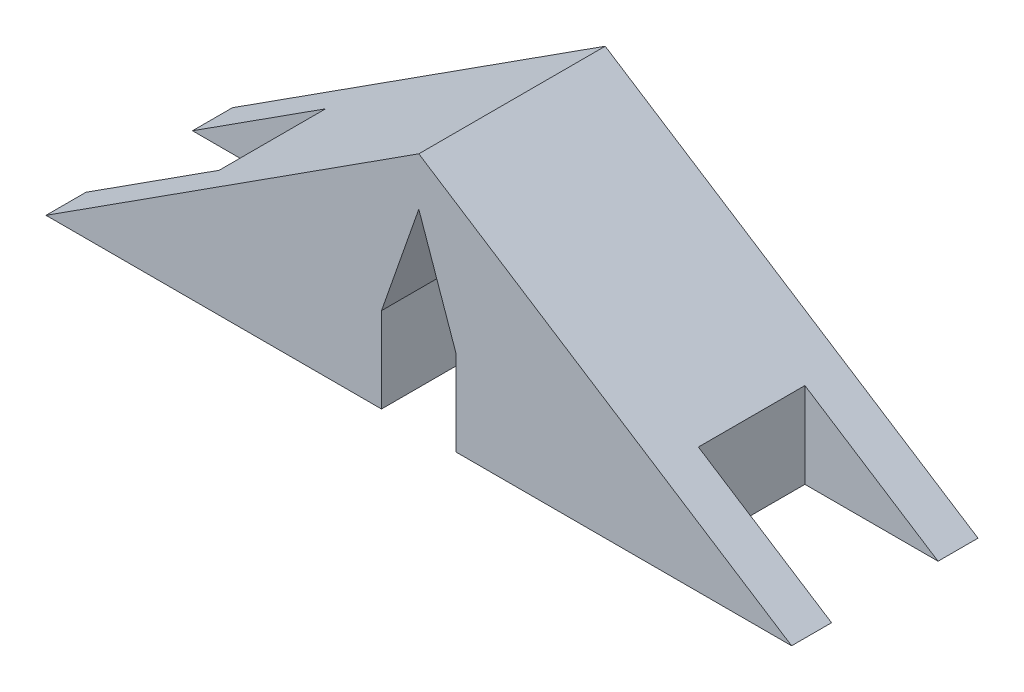
ISO-10303-21;
HEADER;
FILE_DESCRIPTION(('STEP AP214'),'2;1');
FILE_NAME('part.step','',(''),(''),'','','');
FILE_SCHEMA(('AUTOMOTIVE_DESIGN { 1 0 10303 214 1 1 1 1 }'));
ENDSEC;
DATA;
#1=APPLICATION_CONTEXT('core data for automotive mechanical design processes');
#2=APPLICATION_PROTOCOL_DEFINITION('international standard','automotive_design',2000,#1);
#3=PRODUCT_CONTEXT('',#1,'mechanical');
#4=PRODUCT('Part','Part','',(#3));
#5=PRODUCT_RELATED_PRODUCT_CATEGORY('part','',(#4));
#6=PRODUCT_DEFINITION_FORMATION('','',#4);
#7=PRODUCT_DEFINITION_CONTEXT('part definition',#1,'design');
#8=PRODUCT_DEFINITION('design','',#6,#7);
#9=PRODUCT_DEFINITION_SHAPE('','',#8);
#10=(LENGTH_UNIT() NAMED_UNIT(*) SI_UNIT(.MILLI.,.METRE.));
#11=(NAMED_UNIT(*) PLANE_ANGLE_UNIT() SI_UNIT($,.RADIAN.));
#12=(NAMED_UNIT(*) SI_UNIT($,.STERADIAN.) SOLID_ANGLE_UNIT());
#13=UNCERTAINTY_MEASURE_WITH_UNIT(LENGTH_MEASURE(1.E-05),#10,'distance_accuracy_value','');
#14=(GEOMETRIC_REPRESENTATION_CONTEXT(3) GLOBAL_UNCERTAINTY_ASSIGNED_CONTEXT((#13)) GLOBAL_UNIT_ASSIGNED_CONTEXT((#10,
#11,#12)) REPRESENTATION_CONTEXT('',''));
#15=CARTESIAN_POINT('',(0.,0.,0.));
#16=DIRECTION('',(0.,0.,1.));
#17=DIRECTION('',(1.,0.,0.));
#18=AXIS2_PLACEMENT_3D('',#15,#16,#17);
#19=CARTESIAN_POINT('',(70.,-22.5,35.));
#20=DIRECTION('',(0.,-1.,0.));
#21=DIRECTION('',(0.,0.,-1.));
#22=AXIS2_PLACEMENT_3D('',#19,#20,#21);
#23=PLANE('',#22);
#24=DIRECTION('',(0.,0.,-1.));
#25=VECTOR('',#24,1.);
#26=CARTESIAN_POINT('',(105.,-22.5,35.));
#27=LINE('',#26,#25);
#28=CARTESIAN_POINT('',(105.,-22.5,7.50000000000001));
#29=VERTEX_POINT('',#28);
#30=CARTESIAN_POINT('',(105.,-22.5,0.));
#31=VERTEX_POINT('',#30);
#32=EDGE_CURVE('E162',#29,#31,#27,.T.);
#33=ORIENTED_EDGE('',*,*,#32,.F.);
#34=DIRECTION('',(-1.,0.,0.));
#35=VECTOR('',#34,1.);
#36=CARTESIAN_POINT('',(80.,-22.5,7.50000000000001));
#37=LINE('',#36,#35);
#38=CARTESIAN_POINT('',(80.,-22.5,7.50000000000001));
#39=VERTEX_POINT('',#38);
#40=EDGE_CURVE('E225',#29,#39,#37,.T.);
#41=ORIENTED_EDGE('',*,*,#40,.T.);
#42=DIRECTION('',(0.,0.,1.));
#43=VECTOR('',#42,1.);
#44=CARTESIAN_POINT('',(80.,-22.5,7.50000000000001));
#45=LINE('',#44,#43);
#46=CARTESIAN_POINT('',(80.,-22.5,27.5));
#47=VERTEX_POINT('',#46);
#48=EDGE_CURVE('E153',#39,#47,#45,.T.);
#49=ORIENTED_EDGE('',*,*,#48,.T.);
#50=DIRECTION('',(1.,0.,0.));
#51=VECTOR('',#50,1.);
#52=CARTESIAN_POINT('',(80.,-22.5,27.5));
#53=LINE('',#52,#51);
#54=CARTESIAN_POINT('',(105.,-22.5,27.5));
#55=VERTEX_POINT('',#54);
#56=EDGE_CURVE('E139',#47,#55,#53,.T.);
#57=ORIENTED_EDGE('',*,*,#56,.T.);
#58=CARTESIAN_POINT('',(105.,-22.5,35.));
#59=VERTEX_POINT('',#58);
#60=EDGE_CURVE('E149',#59,#55,#27,.T.);
#61=ORIENTED_EDGE('',*,*,#60,.F.);
#62=DIRECTION('',(-1.,0.,0.));
#63=VECTOR('',#62,1.);
#64=CARTESIAN_POINT('',(70.,-22.5,35.));
#65=LINE('',#64,#63);
#66=CARTESIAN_POINT('',(42.,-22.5,35.));
#67=VERTEX_POINT('',#66);
#68=EDGE_CURVE('E242',#59,#67,#65,.T.);
#69=ORIENTED_EDGE('',*,*,#68,.T.);
#70=DIRECTION('',(0.,0.,-1.));
#71=VECTOR('',#70,1.);
#72=CARTESIAN_POINT('',(42.,-22.5,35.));
#73=LINE('',#72,#71);
#74=CARTESIAN_POINT('',(42.,-22.5,0.));
#75=VERTEX_POINT('',#74);
#76=EDGE_CURVE('E161',#67,#75,#73,.T.);
#77=ORIENTED_EDGE('',*,*,#76,.T.);
#78=DIRECTION('',(-1.,0.,0.));
#79=VECTOR('',#78,1.);
#80=CARTESIAN_POINT('',(70.,-22.5,0.));
#81=LINE('',#80,#79);
#82=EDGE_CURVE('E227',#31,#75,#81,.T.);
#83=ORIENTED_EDGE('',*,*,#82,.F.);
#84=EDGE_LOOP('',(#33,#41,#49,#57,#61,#69,#77,#83));
#85=FACE_BOUND('',#84,.T.);
#86=ADVANCED_FACE('F36',(#85),#23,.T.);
#87=CARTESIAN_POINT('',(70.,0.,35.));
#88=DIRECTION('',(-0.540757591313499,-0.841178475376554,0.));
#89=DIRECTION('',(0.841178475376554,-0.540757591313499,0.));
#90=AXIS2_PLACEMENT_3D('',#87,#88,#89);
#91=PLANE('',#90);
#92=DIRECTION('',(-0.841178475376554,0.540757591313499,0.));
#93=VECTOR('',#92,1.);
#94=CARTESIAN_POINT('',(70.,0.,7.50000000000001));
#95=LINE('',#94,#93);
#96=CARTESIAN_POINT('',(80.,-6.42857142857142,7.50000000000001));
#97=VERTEX_POINT('',#96);
#98=EDGE_CURVE('E11',#29,#97,#95,.T.);
#99=ORIENTED_EDGE('',*,*,#98,.F.);
#100=ORIENTED_EDGE('',*,*,#32,.T.);
#101=DIRECTION('',(-0.841178475376554,0.540757591313499,0.));
#102=VECTOR('',#101,1.);
#103=CARTESIAN_POINT('',(70.,0.,0.));
#104=LINE('',#103,#102);
#105=CARTESIAN_POINT('',(35.,22.5,0.));
#106=VERTEX_POINT('',#105);
#107=EDGE_CURVE('E231',#31,#106,#104,.T.);
#108=ORIENTED_EDGE('',*,*,#107,.T.);
#109=DIRECTION('',(0.,0.,-1.));
#110=VECTOR('',#109,1.);
#111=CARTESIAN_POINT('',(35.,22.5,35.));
#112=LINE('',#111,#110);
#113=CARTESIAN_POINT('',(35.,22.5,35.));
#114=VERTEX_POINT('',#113);
#115=EDGE_CURVE('E211',#114,#106,#112,.T.);
#116=ORIENTED_EDGE('',*,*,#115,.F.);
#117=DIRECTION('',(-0.841178475376554,0.540757591313499,0.));
#118=VECTOR('',#117,1.);
#119=CARTESIAN_POINT('',(70.,0.,35.));
#120=LINE('',#119,#118);
#121=EDGE_CURVE('E159',#59,#114,#120,.T.);
#122=ORIENTED_EDGE('',*,*,#121,.F.);
#123=ORIENTED_EDGE('',*,*,#60,.T.);
#124=DIRECTION('',(0.841178475376554,-0.540757591313499,0.));
#125=VECTOR('',#124,1.);
#126=CARTESIAN_POINT('',(70.,0.,27.5));
#127=LINE('',#126,#125);
#128=CARTESIAN_POINT('',(80.,-6.42857142857143,27.5));
#129=VERTEX_POINT('',#128);
#130=EDGE_CURVE('E136',#129,#55,#127,.T.);
#131=ORIENTED_EDGE('',*,*,#130,.F.);
#132=DIRECTION('',(0.,0.,1.));
#133=VECTOR('',#132,1.);
#134=CARTESIAN_POINT('',(80.,-6.42857142857143,35.));
#135=LINE('',#134,#133);
#136=EDGE_CURVE('E44',#97,#129,#135,.T.);
#137=ORIENTED_EDGE('',*,*,#136,.F.);
#138=EDGE_LOOP('',(#99,#100,#108,#116,#122,#123,#131,#137));
#139=FACE_BOUND('',#138,.T.);
#140=ADVANCED_FACE('F156',(#139),#91,.F.);
#141=CARTESIAN_POINT('',(28.,0.,35.));
#142=DIRECTION('',(-1.,0.,0.));
#143=DIRECTION('',(0.,-1.,0.));
#144=AXIS2_PLACEMENT_3D('',#141,#142,#143);
#145=PLANE('',#144);
#146=DIRECTION('',(0.,1.,0.));
#147=VECTOR('',#146,1.);
#148=CARTESIAN_POINT('',(28.,0.,0.));
#149=LINE('',#148,#147);
#150=CARTESIAN_POINT('',(28.,-22.5,0.));
#151=VERTEX_POINT('',#150);
#152=CARTESIAN_POINT('',(28.,-6.5,0.));
#153=VERTEX_POINT('',#152);
#154=EDGE_CURVE('E185',#151,#153,#149,.T.);
#155=ORIENTED_EDGE('',*,*,#154,.T.);
#156=DIRECTION('',(0.,0.,-1.));
#157=VECTOR('',#156,1.);
#158=CARTESIAN_POINT('',(28.,-6.5,35.));
#159=LINE('',#158,#157);
#160=CARTESIAN_POINT('',(28.,-6.5,35.));
#161=VERTEX_POINT('',#160);
#162=EDGE_CURVE('E144',#161,#153,#159,.T.);
#163=ORIENTED_EDGE('',*,*,#162,.F.);
#164=DIRECTION('',(0.,1.,0.));
#165=VECTOR('',#164,1.);
#166=CARTESIAN_POINT('',(28.,0.,35.));
#167=LINE('',#166,#165);
#168=CARTESIAN_POINT('',(28.,-22.5,35.));
#169=VERTEX_POINT('',#168);
#170=EDGE_CURVE('E186',#169,#161,#167,.T.);
#171=ORIENTED_EDGE('',*,*,#170,.F.);
#172=DIRECTION('',(0.,0.,-1.));
#173=VECTOR('',#172,1.);
#174=CARTESIAN_POINT('',(28.,-22.5,35.));
#175=LINE('',#174,#173);
#176=EDGE_CURVE('E196',#169,#151,#175,.T.);
#177=ORIENTED_EDGE('',*,*,#176,.T.);
#178=EDGE_LOOP('',(#155,#163,#171,#177));
#179=FACE_BOUND('',#178,.T.);
#180=ADVANCED_FACE('F38',(#179),#145,.F.);
#181=CARTESIAN_POINT('',(26.9710467706013,-9.43986636971046,35.));
#182=DIRECTION('',(-0.943858356366018,0.330350424728106,0.));
#183=DIRECTION('',(-0.330350424728106,-0.943858356366018,0.));
#184=AXIS2_PLACEMENT_3D('',#181,#182,#183);
#185=PLANE('',#184);
#186=DIRECTION('',(0.330350424728106,0.943858356366018,0.));
#187=VECTOR('',#186,1.);
#188=CARTESIAN_POINT('',(26.9710467706013,-9.43986636971046,0.));
#189=LINE('',#188,#187);
#190=CARTESIAN_POINT('',(35.,13.5,0.));
#191=VERTEX_POINT('',#190);
#192=EDGE_CURVE('E199',#153,#191,#189,.T.);
#193=ORIENTED_EDGE('',*,*,#192,.T.);
#194=DIRECTION('',(0.,0.,-1.));
#195=VECTOR('',#194,1.);
#196=CARTESIAN_POINT('',(35.,13.5,35.));
#197=LINE('',#196,#195);
#198=CARTESIAN_POINT('',(35.,13.5,35.));
#199=VERTEX_POINT('',#198);
#200=EDGE_CURVE('E213',#199,#191,#197,.T.);
#201=ORIENTED_EDGE('',*,*,#200,.F.);
#202=DIRECTION('',(0.330350424728106,0.943858356366018,0.));
#203=VECTOR('',#202,1.);
#204=CARTESIAN_POINT('',(26.9710467706013,-9.43986636971046,35.));
#205=LINE('',#204,#203);
#206=EDGE_CURVE('E189',#161,#199,#205,.T.);
#207=ORIENTED_EDGE('',*,*,#206,.F.);
#208=ORIENTED_EDGE('',*,*,#162,.T.);
#209=EDGE_LOOP('',(#193,#201,#207,#208));
#210=FACE_BOUND('',#209,.T.);
#211=ADVANCED_FACE('F260',(#210),#185,.F.);
#212=CARTESIAN_POINT('',(0.,0.,35.));
#213=DIRECTION('',(-0.540757591313499,0.841178475376554,0.));
#214=DIRECTION('',(-0.841178475376554,-0.540757591313499,0.));
#215=AXIS2_PLACEMENT_3D('',#212,#213,#214);
#216=PLANE('',#215);
#217=DIRECTION('',(0.841178475376554,0.540757591313499,0.));
#218=VECTOR('',#217,1.);
#219=CARTESIAN_POINT('',(0.,0.,27.5));
#220=LINE('',#219,#218);
#221=CARTESIAN_POINT('',(-35.,-22.5,27.5));
#222=VERTEX_POINT('',#221);
#223=CARTESIAN_POINT('',(-10.,-6.42857142857142,27.5));
#224=VERTEX_POINT('',#223);
#225=EDGE_CURVE('E183',#222,#224,#220,.T.);
#226=ORIENTED_EDGE('',*,*,#225,.F.);
#227=DIRECTION('',(0.,0.,-1.));
#228=VECTOR('',#227,1.);
#229=CARTESIAN_POINT('',(-35.,-22.5,35.));
#230=LINE('',#229,#228);
#231=CARTESIAN_POINT('',(-35.,-22.5,35.));
#232=VERTEX_POINT('',#231);
#233=EDGE_CURVE('E208',#232,#222,#230,.T.);
#234=ORIENTED_EDGE('',*,*,#233,.F.);
#235=DIRECTION('',(0.841178475376554,0.540757591313499,0.));
#236=VECTOR('',#235,1.);
#237=CARTESIAN_POINT('',(0.,0.,35.));
#238=LINE('',#237,#236);
#239=EDGE_CURVE('E192',#232,#114,#238,.T.);
#240=ORIENTED_EDGE('',*,*,#239,.T.);
#241=ORIENTED_EDGE('',*,*,#115,.T.);
#242=DIRECTION('',(0.841178475376554,0.540757591313499,0.));
#243=VECTOR('',#242,1.);
#244=CARTESIAN_POINT('',(0.,0.,0.));
#245=LINE('',#244,#243);
#246=CARTESIAN_POINT('',(-35.,-22.5,0.));
#247=VERTEX_POINT('',#246);
#248=EDGE_CURVE('E201',#247,#106,#245,.T.);
#249=ORIENTED_EDGE('',*,*,#248,.F.);
#250=CARTESIAN_POINT('',(-35.,-22.5,7.50000000000001));
#251=VERTEX_POINT('',#250);
#252=EDGE_CURVE('E207',#251,#247,#230,.T.);
#253=ORIENTED_EDGE('',*,*,#252,.F.);
#254=DIRECTION('',(-0.841178475376554,-0.540757591313499,0.));
#255=VECTOR('',#254,1.);
#256=CARTESIAN_POINT('',(0.,0.,7.50000000000001));
#257=LINE('',#256,#255);
#258=CARTESIAN_POINT('',(-10.,-6.42857142857142,7.50000000000001));
#259=VERTEX_POINT('',#258);
#260=EDGE_CURVE('E59',#259,#251,#257,.T.);
#261=ORIENTED_EDGE('',*,*,#260,.F.);
#262=DIRECTION('',(0.,0.,-1.));
#263=VECTOR('',#262,1.);
#264=CARTESIAN_POINT('',(-10.,-6.42857142857143,35.));
#265=LINE('',#264,#263);
#266=EDGE_CURVE('E181',#224,#259,#265,.T.);
#267=ORIENTED_EDGE('',*,*,#266,.F.);
#268=EDGE_LOOP('',(#226,#234,#240,#241,#249,#253,#261,#267));
#269=FACE_BOUND('',#268,.T.);
#270=ADVANCED_FACE('F275',(#269),#216,.T.);
#271=CARTESIAN_POINT('',(0.,-22.5,35.));
#272=DIRECTION('',(0.,1.,0.));
#273=DIRECTION('',(0.,0.,1.));
#274=AXIS2_PLACEMENT_3D('',#271,#272,#273);
#275=PLANE('',#274);
#276=ORIENTED_EDGE('',*,*,#233,.T.);
#277=DIRECTION('',(-1.,0.,0.));
#278=VECTOR('',#277,1.);
#279=CARTESIAN_POINT('',(-10.,-22.5,27.5));
#280=LINE('',#279,#278);
#281=CARTESIAN_POINT('',(-10.,-22.5,27.5));
#282=VERTEX_POINT('',#281);
#283=EDGE_CURVE('E174',#282,#222,#280,.T.);
#284=ORIENTED_EDGE('',*,*,#283,.F.);
#285=DIRECTION('',(0.,0.,1.));
#286=VECTOR('',#285,1.);
#287=CARTESIAN_POINT('',(-10.,-22.5,7.50000000000001));
#288=LINE('',#287,#286);
#289=CARTESIAN_POINT('',(-10.,-22.5,7.50000000000001));
#290=VERTEX_POINT('',#289);
#291=EDGE_CURVE('E171',#290,#282,#288,.T.);
#292=ORIENTED_EDGE('',*,*,#291,.F.);
#293=DIRECTION('',(1.,0.,0.));
#294=VECTOR('',#293,1.);
#295=CARTESIAN_POINT('',(-10.,-22.5,7.50000000000001));
#296=LINE('',#295,#294);
#297=EDGE_CURVE('E164',#251,#290,#296,.T.);
#298=ORIENTED_EDGE('',*,*,#297,.F.);
#299=ORIENTED_EDGE('',*,*,#252,.T.);
#300=DIRECTION('',(1.,0.,0.));
#301=VECTOR('',#300,1.);
#302=CARTESIAN_POINT('',(0.,-22.5,0.));
#303=LINE('',#302,#301);
#304=EDGE_CURVE('E190',#247,#151,#303,.T.);
#305=ORIENTED_EDGE('',*,*,#304,.T.);
#306=ORIENTED_EDGE('',*,*,#176,.F.);
#307=DIRECTION('',(1.,0.,0.));
#308=VECTOR('',#307,1.);
#309=CARTESIAN_POINT('',(0.,-22.5,35.));
#310=LINE('',#309,#308);
#311=EDGE_CURVE('E194',#232,#169,#310,.T.);
#312=ORIENTED_EDGE('',*,*,#311,.F.);
#313=EDGE_LOOP('',(#276,#284,#292,#298,#299,#305,#306,#312));
#314=FACE_BOUND('',#313,.T.);
#315=ADVANCED_FACE('F269',(#314),#275,.F.);
#316=CARTESIAN_POINT('',(0.,0.,35.));
#317=DIRECTION('',(0.,0.,1.));
#318=DIRECTION('',(1.,0.,0.));
#319=AXIS2_PLACEMENT_3D('',#316,#317,#318);
#320=PLANE('',#319);
#321=ORIENTED_EDGE('',*,*,#170,.T.);
#322=ORIENTED_EDGE('',*,*,#206,.T.);
#323=DIRECTION('',(-0.330350424728106,0.943858356366018,0.));
#324=VECTOR('',#323,1.);
#325=CARTESIAN_POINT('',(43.0289532293987,-9.43986636971046,35.));
#326=LINE('',#325,#324);
#327=CARTESIAN_POINT('',(42.,-6.5,35.));
#328=VERTEX_POINT('',#327);
#329=EDGE_CURVE('E251',#328,#199,#326,.T.);
#330=ORIENTED_EDGE('',*,*,#329,.F.);
#331=DIRECTION('',(0.,1.,0.));
#332=VECTOR('',#331,1.);
#333=CARTESIAN_POINT('',(42.,0.,35.));
#334=LINE('',#333,#332);
#335=EDGE_CURVE('E239',#67,#328,#334,.T.);
#336=ORIENTED_EDGE('',*,*,#335,.F.);
#337=ORIENTED_EDGE('',*,*,#68,.F.);
#338=ORIENTED_EDGE('',*,*,#121,.T.);
#339=ORIENTED_EDGE('',*,*,#239,.F.);
#340=ORIENTED_EDGE('',*,*,#311,.T.);
#341=EDGE_LOOP('',(#321,#322,#330,#336,#337,#338,#339,#340));
#342=FACE_BOUND('',#341,.T.);
#343=ADVANCED_FACE('F278',(#342),#320,.T.);
#344=CARTESIAN_POINT('',(0.,0.,0.));
#345=DIRECTION('',(0.,0.,1.));
#346=DIRECTION('',(1.,0.,0.));
#347=AXIS2_PLACEMENT_3D('',#344,#345,#346);
#348=PLANE('',#347);
#349=ORIENTED_EDGE('',*,*,#154,.F.);
#350=ORIENTED_EDGE('',*,*,#304,.F.);
#351=ORIENTED_EDGE('',*,*,#248,.T.);
#352=ORIENTED_EDGE('',*,*,#107,.F.);
#353=ORIENTED_EDGE('',*,*,#82,.T.);
#354=DIRECTION('',(0.,1.,0.));
#355=VECTOR('',#354,1.);
#356=CARTESIAN_POINT('',(42.,0.,0.));
#357=LINE('',#356,#355);
#358=CARTESIAN_POINT('',(42.,-6.5,0.));
#359=VERTEX_POINT('',#358);
#360=EDGE_CURVE('E232',#75,#359,#357,.T.);
#361=ORIENTED_EDGE('',*,*,#360,.T.);
#362=DIRECTION('',(-0.330350424728106,0.943858356366018,0.));
#363=VECTOR('',#362,1.);
#364=CARTESIAN_POINT('',(43.0289532293987,-9.43986636971046,0.));
#365=LINE('',#364,#363);
#366=EDGE_CURVE('E234',#359,#191,#365,.T.);
#367=ORIENTED_EDGE('',*,*,#366,.T.);
#368=ORIENTED_EDGE('',*,*,#192,.F.);
#369=EDGE_LOOP('',(#349,#350,#351,#352,#353,#361,#367,#368));
#370=FACE_BOUND('',#369,.T.);
#371=ADVANCED_FACE('F256',(#370),#348,.F.);
#372=CARTESIAN_POINT('',(-10.,22.5,27.5));
#373=DIRECTION('',(0.,0.,1.));
#374=DIRECTION('',(1.,0.,0.));
#375=AXIS2_PLACEMENT_3D('',#372,#373,#374);
#376=PLANE('',#375);
#377=ORIENTED_EDGE('',*,*,#225,.T.);
#378=DIRECTION('',(0.,-1.,0.));
#379=VECTOR('',#378,1.);
#380=CARTESIAN_POINT('',(-10.,22.5,27.5));
#381=LINE('',#380,#379);
#382=EDGE_CURVE('E177',#224,#282,#381,.T.);
#383=ORIENTED_EDGE('',*,*,#382,.T.);
#384=ORIENTED_EDGE('',*,*,#283,.T.);
#385=EDGE_LOOP('',(#377,#383,#384));
#386=FACE_BOUND('',#385,.T.);
#387=ADVANCED_FACE('F285',(#386),#376,.F.);
#388=CARTESIAN_POINT('',(-10.,22.5,7.50000000000001));
#389=DIRECTION('',(1.,0.,0.));
#390=DIRECTION('',(0.,0.,-1.));
#391=AXIS2_PLACEMENT_3D('',#388,#389,#390);
#392=PLANE('',#391);
#393=ORIENTED_EDGE('',*,*,#266,.T.);
#394=DIRECTION('',(0.,-1.,0.));
#395=VECTOR('',#394,1.);
#396=CARTESIAN_POINT('',(-10.,22.5,7.50000000000001));
#397=LINE('',#396,#395);
#398=EDGE_CURVE('E176',#259,#290,#397,.T.);
#399=ORIENTED_EDGE('',*,*,#398,.T.);
#400=ORIENTED_EDGE('',*,*,#291,.T.);
#401=ORIENTED_EDGE('',*,*,#382,.F.);
#402=EDGE_LOOP('',(#393,#399,#400,#401));
#403=FACE_BOUND('',#402,.T.);
#404=ADVANCED_FACE('F302',(#403),#392,.F.);
#405=CARTESIAN_POINT('',(-10.,22.5,7.50000000000001));
#406=DIRECTION('',(0.,0.,-1.));
#407=DIRECTION('',(-1.,0.,0.));
#408=AXIS2_PLACEMENT_3D('',#405,#406,#407);
#409=PLANE('',#408);
#410=ORIENTED_EDGE('',*,*,#260,.T.);
#411=ORIENTED_EDGE('',*,*,#297,.T.);
#412=ORIENTED_EDGE('',*,*,#398,.F.);
#413=EDGE_LOOP('',(#410,#411,#412));
#414=FACE_BOUND('',#413,.T.);
#415=ADVANCED_FACE('F299',(#414),#409,.F.);
#416=CARTESIAN_POINT('',(42.,0.,35.));
#417=DIRECTION('',(-1.,0.,0.));
#418=DIRECTION('',(0.,-1.,0.));
#419=AXIS2_PLACEMENT_3D('',#416,#417,#418);
#420=PLANE('',#419);
#421=ORIENTED_EDGE('',*,*,#360,.F.);
#422=ORIENTED_EDGE('',*,*,#76,.F.);
#423=ORIENTED_EDGE('',*,*,#335,.T.);
#424=DIRECTION('',(0.,0.,-1.));
#425=VECTOR('',#424,1.);
#426=CARTESIAN_POINT('',(42.,-6.5,35.));
#427=LINE('',#426,#425);
#428=EDGE_CURVE('E166',#328,#359,#427,.T.);
#429=ORIENTED_EDGE('',*,*,#428,.T.);
#430=EDGE_LOOP('',(#421,#422,#423,#429));
#431=FACE_BOUND('',#430,.T.);
#432=ADVANCED_FACE('F254',(#431),#420,.T.);
#433=CARTESIAN_POINT('',(43.0289532293987,-9.43986636971046,35.));
#434=DIRECTION('',(-0.943858356366018,-0.330350424728106,0.));
#435=DIRECTION('',(0.330350424728106,-0.943858356366018,0.));
#436=AXIS2_PLACEMENT_3D('',#433,#434,#435);
#437=PLANE('',#436);
#438=ORIENTED_EDGE('',*,*,#366,.F.);
#439=ORIENTED_EDGE('',*,*,#428,.F.);
#440=ORIENTED_EDGE('',*,*,#329,.T.);
#441=ORIENTED_EDGE('',*,*,#200,.T.);
#442=EDGE_LOOP('',(#438,#439,#440,#441));
#443=FACE_BOUND('',#442,.T.);
#444=ADVANCED_FACE('F257',(#443),#437,.T.);
#445=CARTESIAN_POINT('',(80.,22.5,7.50000000000001));
#446=DIRECTION('',(0.,0.,1.));
#447=DIRECTION('',(1.,0.,0.));
#448=AXIS2_PLACEMENT_3D('',#445,#446,#447);
#449=PLANE('',#448);
#450=ORIENTED_EDGE('',*,*,#98,.T.);
#451=DIRECTION('',(0.,-1.,0.));
#452=VECTOR('',#451,1.);
#453=CARTESIAN_POINT('',(80.,22.5,7.50000000000001));
#454=LINE('',#453,#452);
#455=EDGE_CURVE('E220',#97,#39,#454,.T.);
#456=ORIENTED_EDGE('',*,*,#455,.T.);
#457=ORIENTED_EDGE('',*,*,#40,.F.);
#458=EDGE_LOOP('',(#450,#456,#457));
#459=FACE_BOUND('',#458,.T.);
#460=ADVANCED_FACE('F322',(#459),#449,.T.);
#461=CARTESIAN_POINT('',(80.,22.5,7.50000000000001));
#462=DIRECTION('',(1.,0.,0.));
#463=DIRECTION('',(0.,0.,-1.));
#464=AXIS2_PLACEMENT_3D('',#461,#462,#463);
#465=PLANE('',#464);
#466=ORIENTED_EDGE('',*,*,#136,.T.);
#467=DIRECTION('',(0.,-1.,0.));
#468=VECTOR('',#467,1.);
#469=CARTESIAN_POINT('',(80.,22.5,27.5));
#470=LINE('',#469,#468);
#471=EDGE_CURVE('E51',#129,#47,#470,.T.);
#472=ORIENTED_EDGE('',*,*,#471,.T.);
#473=ORIENTED_EDGE('',*,*,#48,.F.);
#474=ORIENTED_EDGE('',*,*,#455,.F.);
#475=EDGE_LOOP('',(#466,#472,#473,#474));
#476=FACE_BOUND('',#475,.T.);
#477=ADVANCED_FACE('F219',(#476),#465,.T.);
#478=CARTESIAN_POINT('',(80.,22.5,27.5));
#479=DIRECTION('',(0.,0.,-1.));
#480=DIRECTION('',(-1.,0.,0.));
#481=AXIS2_PLACEMENT_3D('',#478,#479,#480);
#482=PLANE('',#481);
#483=ORIENTED_EDGE('',*,*,#130,.T.);
#484=ORIENTED_EDGE('',*,*,#56,.F.);
#485=ORIENTED_EDGE('',*,*,#471,.F.);
#486=EDGE_LOOP('',(#483,#484,#485));
#487=FACE_BOUND('',#486,.T.);
#488=ADVANCED_FACE('F138',(#487),#482,.T.);
#489=CLOSED_SHELL('',(#86,#140,#180,#211,#270,#315,#343,#371,#387,#404,#415,#432,#444,#460,#477,#488));
#490=MANIFOLD_SOLID_BREP('B2',#489);
#491=ADVANCED_BREP_SHAPE_REPRESENTATION('',(#18,#490),#14);
#492=SHAPE_DEFINITION_REPRESENTATION(#9,#491);
ENDSEC;
END-ISO-10303-21;
